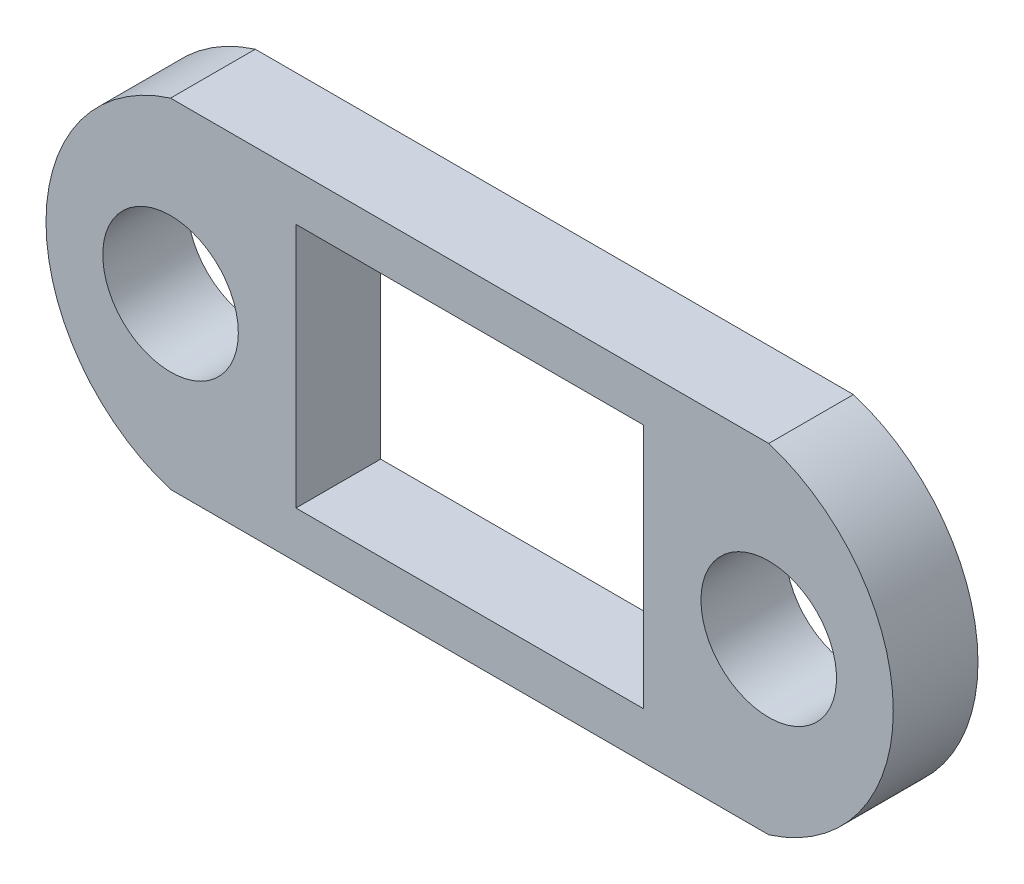
ISO-10303-21;
HEADER;
FILE_DESCRIPTION(('STEP AP214'),'2;1');
FILE_NAME('part.step','',(''),(''),'','','');
FILE_SCHEMA(('AUTOMOTIVE_DESIGN { 1 0 10303 214 1 1 1 1 }'));
ENDSEC;
DATA;
#1=APPLICATION_CONTEXT('core data for automotive mechanical design processes');
#2=APPLICATION_PROTOCOL_DEFINITION('international standard','automotive_design',2000,#1);
#3=PRODUCT_CONTEXT('',#1,'mechanical');
#4=PRODUCT('Part','Part','',(#3));
#5=PRODUCT_RELATED_PRODUCT_CATEGORY('part','',(#4));
#6=PRODUCT_DEFINITION_FORMATION('','',#4);
#7=PRODUCT_DEFINITION_CONTEXT('part definition',#1,'design');
#8=PRODUCT_DEFINITION('design','',#6,#7);
#9=PRODUCT_DEFINITION_SHAPE('','',#8);
#10=(LENGTH_UNIT() NAMED_UNIT(*) SI_UNIT(.MILLI.,.METRE.));
#11=(NAMED_UNIT(*) PLANE_ANGLE_UNIT() SI_UNIT($,.RADIAN.));
#12=(NAMED_UNIT(*) SI_UNIT($,.STERADIAN.) SOLID_ANGLE_UNIT());
#13=UNCERTAINTY_MEASURE_WITH_UNIT(LENGTH_MEASURE(1.E-05),#10,'distance_accuracy_value','');
#14=(GEOMETRIC_REPRESENTATION_CONTEXT(3) GLOBAL_UNCERTAINTY_ASSIGNED_CONTEXT((#13)) GLOBAL_UNIT_ASSIGNED_CONTEXT((#10,
#11,#12)) REPRESENTATION_CONTEXT('',''));
#15=CARTESIAN_POINT('',(0.,0.,0.));
#16=DIRECTION('',(0.,0.,1.));
#17=DIRECTION('',(1.,0.,0.));
#18=AXIS2_PLACEMENT_3D('',#15,#16,#17);
#19=CARTESIAN_POINT('',(-7.26097848129012,-2.3221281310315E-05,2.5));
#20=DIRECTION('',(0.,0.,1.));
#21=DIRECTION('',(1.,0.,0.));
#22=AXIS2_PLACEMENT_3D('',#19,#20,#21);
#23=PLANE('',#22);
#24=CARTESIAN_POINT('',(-8.825,-2.322128131102E-05,2.5));
#25=DIRECTION('',(0.,0.,1.));
#26=DIRECTION('',(1.,0.,0.));
#27=AXIS2_PLACEMENT_3D('',#24,#25,#26);
#28=CIRCLE('',#27,2.);
#29=CARTESIAN_POINT('',(-6.825,-2.322128131102E-05,2.5));
#30=VERTEX_POINT('',#29);
#31=EDGE_CURVE('E137',#30,#30,#28,.T.);
#32=ORIENTED_EDGE('',*,*,#31,.F.);
#33=EDGE_LOOP('',(#32));
#34=FACE_BOUND('',#33,.T.);
#35=CARTESIAN_POINT('',(-7.26097848129012,-2.3221281310315E-05,2.5));
#36=DIRECTION('',(0.,0.,1.));
#37=DIRECTION('',(1.,0.,0.));
#38=AXIS2_PLACEMENT_3D('',#35,#36,#37);
#39=CIRCLE('',#38,5.23894641385187);
#40=CARTESIAN_POINT('',(-8.825,5.00001640018408,2.5));
#41=VERTEX_POINT('',#40);
#42=CARTESIAN_POINT('',(-8.825,-5.0000628427467,2.5));
#43=VERTEX_POINT('',#42);
#44=EDGE_CURVE('E155',#41,#43,#39,.T.);
#45=ORIENTED_EDGE('',*,*,#44,.T.);
#46=DIRECTION('',(1.,0.,0.));
#47=VECTOR('',#46,1.);
#48=CARTESIAN_POINT('',(-8.825,-5.0000628427467,2.5));
#49=LINE('',#48,#47);
#50=CARTESIAN_POINT('',(8.825,-5.00006284274669,2.5));
#51=VERTEX_POINT('',#50);
#52=EDGE_CURVE('E159',#43,#51,#49,.T.);
#53=ORIENTED_EDGE('',*,*,#52,.T.);
#54=CARTESIAN_POINT('',(7.26097848129012,-2.32212813068455E-05,2.5));
#55=DIRECTION('',(0.,0.,1.));
#56=DIRECTION('',(-1.,0.,0.));
#57=AXIS2_PLACEMENT_3D('',#54,#55,#56);
#58=CIRCLE('',#57,5.23894641385186);
#59=CARTESIAN_POINT('',(8.825,5.00001640018408,2.5));
#60=VERTEX_POINT('',#59);
#61=EDGE_CURVE('E163',#51,#60,#58,.T.);
#62=ORIENTED_EDGE('',*,*,#61,.T.);
#63=DIRECTION('',(-1.,0.,0.));
#64=VECTOR('',#63,1.);
#65=CARTESIAN_POINT('',(-8.825,5.00001640018408,2.5));
#66=LINE('',#65,#64);
#67=EDGE_CURVE('E166',#60,#41,#66,.T.);
#68=ORIENTED_EDGE('',*,*,#67,.T.);
#69=EDGE_LOOP('',(#45,#53,#62,#68));
#70=FACE_BOUND('',#69,.T.);
#71=DIRECTION('',(0.,1.,0.));
#72=VECTOR('',#71,1.);
#73=CARTESIAN_POINT('',(5.125,-3.625,2.5));
#74=LINE('',#73,#72);
#75=CARTESIAN_POINT('',(5.125,-3.625,2.5));
#76=VERTEX_POINT('',#75);
#77=CARTESIAN_POINT('',(5.125,3.625,2.5));
#78=VERTEX_POINT('',#77);
#79=EDGE_CURVE('E124',#76,#78,#74,.T.);
#80=ORIENTED_EDGE('',*,*,#79,.F.);
#81=DIRECTION('',(1.,0.,0.));
#82=VECTOR('',#81,1.);
#83=CARTESIAN_POINT('',(-5.125,-3.625,2.5));
#84=LINE('',#83,#82);
#85=CARTESIAN_POINT('',(-5.125,-3.625,2.5));
#86=VERTEX_POINT('',#85);
#87=EDGE_CURVE('E108',#86,#76,#84,.T.);
#88=ORIENTED_EDGE('',*,*,#87,.F.);
#89=DIRECTION('',(0.,-1.,0.));
#90=VECTOR('',#89,1.);
#91=CARTESIAN_POINT('',(-5.125,-2.725,2.5));
#92=LINE('',#91,#90);
#93=CARTESIAN_POINT('',(-5.125,3.625,2.5));
#94=VERTEX_POINT('',#93);
#95=EDGE_CURVE('E102',#94,#86,#92,.T.);
#96=ORIENTED_EDGE('',*,*,#95,.F.);
#97=DIRECTION('',(-1.,0.,0.));
#98=VECTOR('',#97,1.);
#99=CARTESIAN_POINT('',(5.125,3.625,2.5));
#100=LINE('',#99,#98);
#101=EDGE_CURVE('E128',#78,#94,#100,.T.);
#102=ORIENTED_EDGE('',*,*,#101,.F.);
#103=EDGE_LOOP('',(#80,#88,#96,#102));
#104=FACE_BOUND('',#103,.T.);
#105=CARTESIAN_POINT('',(8.825,-2.32212813066832E-05,2.5));
#106=DIRECTION('',(0.,0.,1.));
#107=DIRECTION('',(-1.,0.,0.));
#108=AXIS2_PLACEMENT_3D('',#105,#106,#107);
#109=CIRCLE('',#108,2.);
#110=CARTESIAN_POINT('',(6.825,-2.32212813066832E-05,2.5));
#111=VERTEX_POINT('',#110);
#112=EDGE_CURVE('E257',#111,#111,#109,.T.);
#113=ORIENTED_EDGE('',*,*,#112,.F.);
#114=EDGE_LOOP('',(#113));
#115=FACE_BOUND('',#114,.T.);
#116=ADVANCED_FACE('F39',(#34,#70,#104,#115),#23,.T.);
#117=CARTESIAN_POINT('',(-7.26097848129012,-2.3221281310315E-05,0.));
#118=DIRECTION('',(0.,0.,1.));
#119=DIRECTION('',(1.,0.,0.));
#120=AXIS2_PLACEMENT_3D('',#117,#118,#119);
#121=PLANE('',#120);
#122=CARTESIAN_POINT('',(-7.26097848129012,-2.3221281310315E-05,0.));
#123=DIRECTION('',(0.,0.,1.));
#124=DIRECTION('',(1.,0.,0.));
#125=AXIS2_PLACEMENT_3D('',#122,#123,#124);
#126=CIRCLE('',#125,5.23894641385187);
#127=CARTESIAN_POINT('',(-8.825,5.00001640018408,0.));
#128=VERTEX_POINT('',#127);
#129=CARTESIAN_POINT('',(-8.825,-5.0000628427467,0.));
#130=VERTEX_POINT('',#129);
#131=EDGE_CURVE('E119',#128,#130,#126,.T.);
#132=ORIENTED_EDGE('',*,*,#131,.F.);
#133=DIRECTION('',(-1.,0.,0.));
#134=VECTOR('',#133,1.);
#135=CARTESIAN_POINT('',(-8.825,5.00001640018408,0.));
#136=LINE('',#135,#134);
#137=CARTESIAN_POINT('',(8.825,5.00001640018408,0.));
#138=VERTEX_POINT('',#137);
#139=EDGE_CURVE('E160',#138,#128,#136,.T.);
#140=ORIENTED_EDGE('',*,*,#139,.F.);
#141=CARTESIAN_POINT('',(7.26097848129012,-2.32212813068455E-05,0.));
#142=DIRECTION('',(0.,0.,1.));
#143=DIRECTION('',(-1.,0.,0.));
#144=AXIS2_PLACEMENT_3D('',#141,#142,#143);
#145=CIRCLE('',#144,5.23894641385186);
#146=CARTESIAN_POINT('',(8.825,-5.00006284274669,0.));
#147=VERTEX_POINT('',#146);
#148=EDGE_CURVE('E176',#147,#138,#145,.T.);
#149=ORIENTED_EDGE('',*,*,#148,.F.);
#150=DIRECTION('',(1.,0.,0.));
#151=VECTOR('',#150,1.);
#152=CARTESIAN_POINT('',(-8.825,-5.0000628427467,0.));
#153=LINE('',#152,#151);
#154=EDGE_CURVE('E173',#130,#147,#153,.T.);
#155=ORIENTED_EDGE('',*,*,#154,.F.);
#156=EDGE_LOOP('',(#132,#140,#149,#155));
#157=FACE_BOUND('',#156,.T.);
#158=DIRECTION('',(1.,0.,0.));
#159=VECTOR('',#158,1.);
#160=CARTESIAN_POINT('',(3.085,-3.625,0.));
#161=LINE('',#160,#159);
#162=CARTESIAN_POINT('',(-5.125,-3.625,0.));
#163=VERTEX_POINT('',#162);
#164=CARTESIAN_POINT('',(5.125,-3.625,0.));
#165=VERTEX_POINT('',#164);
#166=EDGE_CURVE('E116',#163,#165,#161,.T.);
#167=ORIENTED_EDGE('',*,*,#166,.T.);
#168=DIRECTION('',(0.,1.,0.));
#169=VECTOR('',#168,1.);
#170=CARTESIAN_POINT('',(5.125,2.725,0.));
#171=LINE('',#170,#169);
#172=CARTESIAN_POINT('',(5.125,3.625,0.));
#173=VERTEX_POINT('',#172);
#174=EDGE_CURVE('E136',#165,#173,#171,.T.);
#175=ORIENTED_EDGE('',*,*,#174,.T.);
#176=DIRECTION('',(-1.,0.,0.));
#177=VECTOR('',#176,1.);
#178=CARTESIAN_POINT('',(-3.085,3.625,0.));
#179=LINE('',#178,#177);
#180=CARTESIAN_POINT('',(-5.125,3.625,0.));
#181=VERTEX_POINT('',#180);
#182=EDGE_CURVE('E141',#173,#181,#179,.T.);
#183=ORIENTED_EDGE('',*,*,#182,.T.);
#184=DIRECTION('',(0.,-1.,0.));
#185=VECTOR('',#184,1.);
#186=CARTESIAN_POINT('',(-5.125,-2.725,0.));
#187=LINE('',#186,#185);
#188=EDGE_CURVE('E109',#181,#163,#187,.T.);
#189=ORIENTED_EDGE('',*,*,#188,.T.);
#190=EDGE_LOOP('',(#167,#175,#183,#189));
#191=FACE_BOUND('',#190,.T.);
#192=CARTESIAN_POINT('',(-8.825,-2.322128131102E-05,0.));
#193=DIRECTION('',(0.,0.,1.));
#194=DIRECTION('',(1.,0.,0.));
#195=AXIS2_PLACEMENT_3D('',#192,#193,#194);
#196=CIRCLE('',#195,2.);
#197=CARTESIAN_POINT('',(-6.825,-2.322128131102E-05,0.));
#198=VERTEX_POINT('',#197);
#199=EDGE_CURVE('E265',#198,#198,#196,.T.);
#200=ORIENTED_EDGE('',*,*,#199,.T.);
#201=EDGE_LOOP('',(#200));
#202=FACE_BOUND('',#201,.T.);
#203=CARTESIAN_POINT('',(8.825,-2.32212813066832E-05,0.));
#204=DIRECTION('',(0.,0.,1.));
#205=DIRECTION('',(-1.,0.,0.));
#206=AXIS2_PLACEMENT_3D('',#203,#204,#205);
#207=CIRCLE('',#206,2.);
#208=CARTESIAN_POINT('',(6.825,-2.32212813066832E-05,0.));
#209=VERTEX_POINT('',#208);
#210=EDGE_CURVE('E260',#209,#209,#207,.T.);
#211=ORIENTED_EDGE('',*,*,#210,.T.);
#212=EDGE_LOOP('',(#211));
#213=FACE_BOUND('',#212,.T.);
#214=ADVANCED_FACE('F199',(#157,#191,#202,#213),#121,.F.);
#215=CARTESIAN_POINT('',(-7.26097848129012,-2.3221281310315E-05,2.5));
#216=DIRECTION('',(0.,0.,-1.));
#217=DIRECTION('',(-1.,0.,0.));
#218=AXIS2_PLACEMENT_3D('',#215,#216,#217);
#219=CYLINDRICAL_SURFACE('',#218,5.23894641385187);
#220=ORIENTED_EDGE('',*,*,#131,.T.);
#221=DIRECTION('',(0.,0.,-1.));
#222=VECTOR('',#221,1.);
#223=CARTESIAN_POINT('',(-8.825,-5.0000628427467,2.5));
#224=LINE('',#223,#222);
#225=EDGE_CURVE('E11',#43,#130,#224,.T.);
#226=ORIENTED_EDGE('',*,*,#225,.F.);
#227=ORIENTED_EDGE('',*,*,#44,.F.);
#228=DIRECTION('',(0.,0.,-1.));
#229=VECTOR('',#228,1.);
#230=CARTESIAN_POINT('',(-8.825,5.00001640018408,2.5));
#231=LINE('',#230,#229);
#232=EDGE_CURVE('E169',#41,#128,#231,.T.);
#233=ORIENTED_EDGE('',*,*,#232,.T.);
#234=EDGE_LOOP('',(#220,#226,#227,#233));
#235=FACE_BOUND('',#234,.T.);
#236=ADVANCED_FACE('F41',(#235),#219,.T.);
#237=CARTESIAN_POINT('',(-8.825,-5.0000628427467,2.5));
#238=DIRECTION('',(0.,1.,0.));
#239=DIRECTION('',(-1.,0.,0.));
#240=AXIS2_PLACEMENT_3D('',#237,#238,#239);
#241=PLANE('',#240);
#242=ORIENTED_EDGE('',*,*,#154,.T.);
#243=DIRECTION('',(0.,0.,-1.));
#244=VECTOR('',#243,1.);
#245=CARTESIAN_POINT('',(8.825,-5.00006284274669,2.5));
#246=LINE('',#245,#244);
#247=EDGE_CURVE('E48',#51,#147,#246,.T.);
#248=ORIENTED_EDGE('',*,*,#247,.F.);
#249=ORIENTED_EDGE('',*,*,#52,.F.);
#250=ORIENTED_EDGE('',*,*,#225,.T.);
#251=EDGE_LOOP('',(#242,#248,#249,#250));
#252=FACE_BOUND('',#251,.T.);
#253=ADVANCED_FACE('F209',(#252),#241,.F.);
#254=CARTESIAN_POINT('',(7.26097848129012,-2.32212813068455E-05,2.5));
#255=DIRECTION('',(0.,0.,-1.));
#256=DIRECTION('',(-1.,0.,0.));
#257=AXIS2_PLACEMENT_3D('',#254,#255,#256);
#258=CYLINDRICAL_SURFACE('',#257,5.23894641385186);
#259=ORIENTED_EDGE('',*,*,#148,.T.);
#260=DIRECTION('',(0.,0.,-1.));
#261=VECTOR('',#260,1.);
#262=CARTESIAN_POINT('',(8.825,5.00001640018408,2.5));
#263=LINE('',#262,#261);
#264=EDGE_CURVE('E184',#60,#138,#263,.T.);
#265=ORIENTED_EDGE('',*,*,#264,.F.);
#266=ORIENTED_EDGE('',*,*,#61,.F.);
#267=ORIENTED_EDGE('',*,*,#247,.T.);
#268=EDGE_LOOP('',(#259,#265,#266,#267));
#269=FACE_BOUND('',#268,.T.);
#270=ADVANCED_FACE('F193',(#269),#258,.T.);
#271=CARTESIAN_POINT('',(-8.825,5.00001640018408,2.5));
#272=DIRECTION('',(0.,-1.,0.));
#273=DIRECTION('',(1.,0.,0.));
#274=AXIS2_PLACEMENT_3D('',#271,#272,#273);
#275=PLANE('',#274);
#276=ORIENTED_EDGE('',*,*,#139,.T.);
#277=ORIENTED_EDGE('',*,*,#232,.F.);
#278=ORIENTED_EDGE('',*,*,#67,.F.);
#279=ORIENTED_EDGE('',*,*,#264,.T.);
#280=EDGE_LOOP('',(#276,#277,#278,#279));
#281=FACE_BOUND('',#280,.T.);
#282=ADVANCED_FACE('F203',(#281),#275,.F.);
#283=CARTESIAN_POINT('',(3.085,-3.625,2.5));
#284=DIRECTION('',(0.,1.,0.));
#285=DIRECTION('',(0.,0.,1.));
#286=AXIS2_PLACEMENT_3D('',#283,#284,#285);
#287=PLANE('',#286);
#288=ORIENTED_EDGE('',*,*,#166,.F.);
#289=DIRECTION('',(0.,0.,-1.));
#290=VECTOR('',#289,1.);
#291=CARTESIAN_POINT('',(-5.125,-3.625,2.5));
#292=LINE('',#291,#290);
#293=EDGE_CURVE('E60',#86,#163,#292,.T.);
#294=ORIENTED_EDGE('',*,*,#293,.F.);
#295=ORIENTED_EDGE('',*,*,#87,.T.);
#296=DIRECTION('',(0.,0.,-1.));
#297=VECTOR('',#296,1.);
#298=CARTESIAN_POINT('',(5.125,-3.625,2.5));
#299=LINE('',#298,#297);
#300=EDGE_CURVE('E120',#76,#165,#299,.T.);
#301=ORIENTED_EDGE('',*,*,#300,.T.);
#302=EDGE_LOOP('',(#288,#294,#295,#301));
#303=FACE_BOUND('',#302,.T.);
#304=ADVANCED_FACE('F112',(#303),#287,.T.);
#305=CARTESIAN_POINT('',(5.125,2.725,2.5));
#306=DIRECTION('',(-1.,0.,0.));
#307=DIRECTION('',(0.,0.,1.));
#308=AXIS2_PLACEMENT_3D('',#305,#306,#307);
#309=PLANE('',#308);
#310=ORIENTED_EDGE('',*,*,#174,.F.);
#311=ORIENTED_EDGE('',*,*,#300,.F.);
#312=ORIENTED_EDGE('',*,*,#79,.T.);
#313=DIRECTION('',(0.,0.,-1.));
#314=VECTOR('',#313,1.);
#315=CARTESIAN_POINT('',(5.125,3.625,2.5));
#316=LINE('',#315,#314);
#317=EDGE_CURVE('E149',#78,#173,#316,.T.);
#318=ORIENTED_EDGE('',*,*,#317,.T.);
#319=EDGE_LOOP('',(#310,#311,#312,#318));
#320=FACE_BOUND('',#319,.T.);
#321=ADVANCED_FACE('F231',(#320),#309,.T.);
#322=CARTESIAN_POINT('',(-3.085,3.625,2.5));
#323=DIRECTION('',(0.,-1.,0.));
#324=DIRECTION('',(0.,0.,-1.));
#325=AXIS2_PLACEMENT_3D('',#322,#323,#324);
#326=PLANE('',#325);
#327=ORIENTED_EDGE('',*,*,#182,.F.);
#328=ORIENTED_EDGE('',*,*,#317,.F.);
#329=ORIENTED_EDGE('',*,*,#101,.T.);
#330=DIRECTION('',(0.,0.,-1.));
#331=VECTOR('',#330,1.);
#332=CARTESIAN_POINT('',(-5.125,3.625,2.5));
#333=LINE('',#332,#331);
#334=EDGE_CURVE('E55',#94,#181,#333,.T.);
#335=ORIENTED_EDGE('',*,*,#334,.T.);
#336=EDGE_LOOP('',(#327,#328,#329,#335));
#337=FACE_BOUND('',#336,.T.);
#338=ADVANCED_FACE('F235',(#337),#326,.T.);
#339=CARTESIAN_POINT('',(-5.125,-2.725,2.5));
#340=DIRECTION('',(1.,0.,0.));
#341=DIRECTION('',(0.,0.,-1.));
#342=AXIS2_PLACEMENT_3D('',#339,#340,#341);
#343=PLANE('',#342);
#344=ORIENTED_EDGE('',*,*,#188,.F.);
#345=ORIENTED_EDGE('',*,*,#334,.F.);
#346=ORIENTED_EDGE('',*,*,#95,.T.);
#347=ORIENTED_EDGE('',*,*,#293,.T.);
#348=EDGE_LOOP('',(#344,#345,#346,#347));
#349=FACE_BOUND('',#348,.T.);
#350=ADVANCED_FACE('F103',(#349),#343,.T.);
#351=CARTESIAN_POINT('',(-8.825,-2.322128131102E-05,2.5));
#352=DIRECTION('',(0.,0.,-1.));
#353=DIRECTION('',(-1.,0.,0.));
#354=AXIS2_PLACEMENT_3D('',#351,#352,#353);
#355=CYLINDRICAL_SURFACE('',#354,2.);
#356=ORIENTED_EDGE('',*,*,#31,.T.);
#357=EDGE_LOOP('',(#356));
#358=FACE_BOUND('',#357,.T.);
#359=ORIENTED_EDGE('',*,*,#199,.F.);
#360=EDGE_LOOP('',(#359));
#361=FACE_BOUND('',#360,.T.);
#362=ADVANCED_FACE('F245',(#358,#361),#355,.F.);
#363=CARTESIAN_POINT('',(8.825,-2.32212813066832E-05,2.5));
#364=DIRECTION('',(0.,0.,-1.));
#365=DIRECTION('',(-1.,0.,0.));
#366=AXIS2_PLACEMENT_3D('',#363,#364,#365);
#367=CYLINDRICAL_SURFACE('',#366,2.);
#368=ORIENTED_EDGE('',*,*,#112,.T.);
#369=EDGE_LOOP('',(#368));
#370=FACE_BOUND('',#369,.T.);
#371=ORIENTED_EDGE('',*,*,#210,.F.);
#372=EDGE_LOOP('',(#371));
#373=FACE_BOUND('',#372,.T.);
#374=ADVANCED_FACE('F248',(#370,#373),#367,.F.);
#375=CLOSED_SHELL('',(#116,#214,#236,#253,#270,#282,#304,#321,#338,#350,#362,#374));
#376=MANIFOLD_SOLID_BREP('B2',#375);
#377=ADVANCED_BREP_SHAPE_REPRESENTATION('',(#18,#376),#14);
#378=SHAPE_DEFINITION_REPRESENTATION(#9,#377);
ENDSEC;
END-ISO-10303-21;
